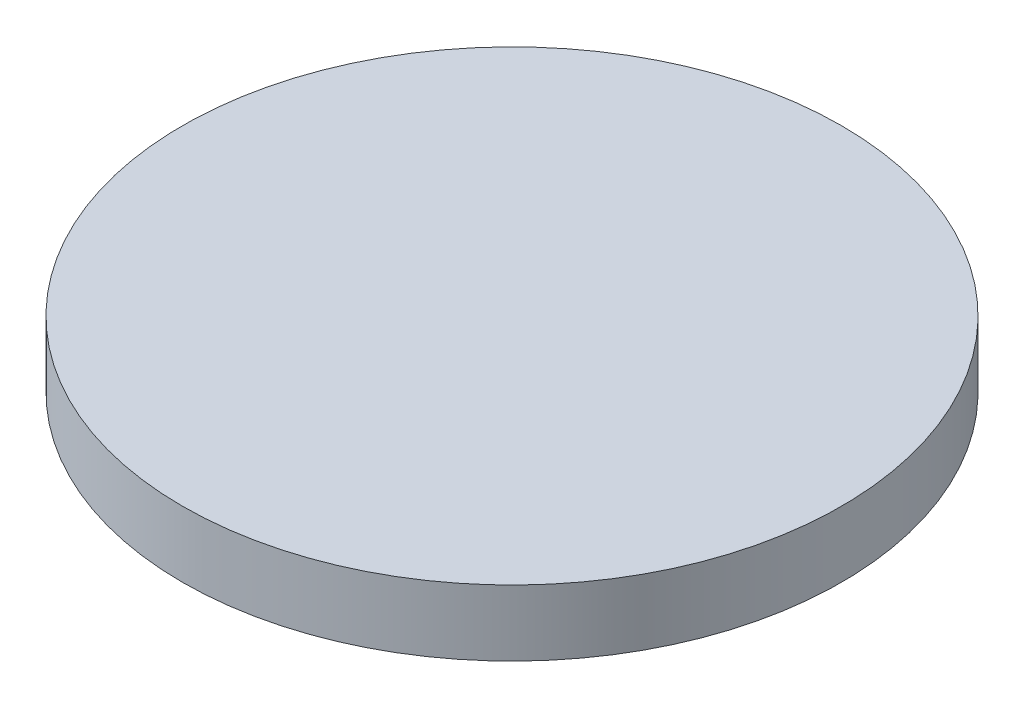
ISO-10303-21;
HEADER;
FILE_DESCRIPTION(('STEP AP214'),'2;1');
FILE_NAME('part.step','',(''),(''),'','','');
FILE_SCHEMA(('AUTOMOTIVE_DESIGN { 1 0 10303 214 1 1 1 1 }'));
ENDSEC;
DATA;
#1=APPLICATION_CONTEXT('core data for automotive mechanical design processes');
#2=APPLICATION_PROTOCOL_DEFINITION('international standard','automotive_design',2000,#1);
#3=PRODUCT_CONTEXT('',#1,'mechanical');
#4=PRODUCT('Part','Part','',(#3));
#5=PRODUCT_RELATED_PRODUCT_CATEGORY('part','',(#4));
#6=PRODUCT_DEFINITION_FORMATION('','',#4);
#7=PRODUCT_DEFINITION_CONTEXT('part definition',#1,'design');
#8=PRODUCT_DEFINITION('design','',#6,#7);
#9=PRODUCT_DEFINITION_SHAPE('','',#8);
#10=(LENGTH_UNIT() NAMED_UNIT(*) SI_UNIT(.MILLI.,.METRE.));
#11=(NAMED_UNIT(*) PLANE_ANGLE_UNIT() SI_UNIT($,.RADIAN.));
#12=(NAMED_UNIT(*) SI_UNIT($,.STERADIAN.) SOLID_ANGLE_UNIT());
#13=UNCERTAINTY_MEASURE_WITH_UNIT(LENGTH_MEASURE(1.E-05),#10,'distance_accuracy_value','');
#14=(GEOMETRIC_REPRESENTATION_CONTEXT(3) GLOBAL_UNCERTAINTY_ASSIGNED_CONTEXT((#13)) GLOBAL_UNIT_ASSIGNED_CONTEXT((#10,
#11,#12)) REPRESENTATION_CONTEXT('',''));
#15=CARTESIAN_POINT('',(0.,0.,0.));
#16=DIRECTION('',(0.,0.,1.));
#17=DIRECTION('',(1.,0.,0.));
#18=AXIS2_PLACEMENT_3D('',#15,#16,#17);
#19=CARTESIAN_POINT('',(0.,50.,0.));
#20=DIRECTION('',(0.,-1.,0.));
#21=DIRECTION('',(0.,0.,-1.));
#22=AXIS2_PLACEMENT_3D('',#19,#20,#21);
#23=CYLINDRICAL_SURFACE('',#22,250.);
#24=CARTESIAN_POINT('',(0.,50.,0.));
#25=DIRECTION('',(0.,1.,0.));
#26=DIRECTION('',(0.,0.,1.));
#27=AXIS2_PLACEMENT_3D('',#24,#25,#26);
#28=CIRCLE('',#27,250.);
#29=CARTESIAN_POINT('',(0.,50.,250.));
#30=VERTEX_POINT('',#29);
#31=EDGE_CURVE('E10',#30,#30,#28,.T.);
#32=ORIENTED_EDGE('',*,*,#31,.F.);
#33=EDGE_LOOP('',(#32));
#34=FACE_BOUND('',#33,.T.);
#35=CARTESIAN_POINT('',(0.,0.,0.));
#36=DIRECTION('',(0.,1.,0.));
#37=DIRECTION('',(0.,0.,1.));
#38=AXIS2_PLACEMENT_3D('',#35,#36,#37);
#39=CIRCLE('',#38,250.);
#40=CARTESIAN_POINT('',(0.,0.,250.));
#41=VERTEX_POINT('',#40);
#42=EDGE_CURVE('E34',#41,#41,#39,.T.);
#43=ORIENTED_EDGE('',*,*,#42,.T.);
#44=EDGE_LOOP('',(#43));
#45=FACE_BOUND('',#44,.T.);
#46=ADVANCED_FACE('F31',(#34,#45),#23,.T.);
#47=CARTESIAN_POINT('',(0.,50.,0.));
#48=DIRECTION('',(0.,1.,0.));
#49=DIRECTION('',(0.,0.,1.));
#50=AXIS2_PLACEMENT_3D('',#47,#48,#49);
#51=PLANE('',#50);
#52=ORIENTED_EDGE('',*,*,#31,.T.);
#53=EDGE_LOOP('',(#52));
#54=FACE_BOUND('',#53,.T.);
#55=ADVANCED_FACE('F46',(#54),#51,.T.);
#56=CARTESIAN_POINT('',(0.,0.,0.));
#57=DIRECTION('',(0.,1.,0.));
#58=DIRECTION('',(0.,0.,1.));
#59=AXIS2_PLACEMENT_3D('',#56,#57,#58);
#60=PLANE('',#59);
#61=ORIENTED_EDGE('',*,*,#42,.F.);
#62=EDGE_LOOP('',(#61));
#63=FACE_BOUND('',#62,.T.);
#64=ADVANCED_FACE('F44',(#63),#60,.F.);
#65=CLOSED_SHELL('',(#46,#55,#64));
#66=MANIFOLD_SOLID_BREP('B2',#65);
#67=ADVANCED_BREP_SHAPE_REPRESENTATION('',(#18,#66),#14);
#68=SHAPE_DEFINITION_REPRESENTATION(#9,#67);
ENDSEC;
END-ISO-10303-21;
